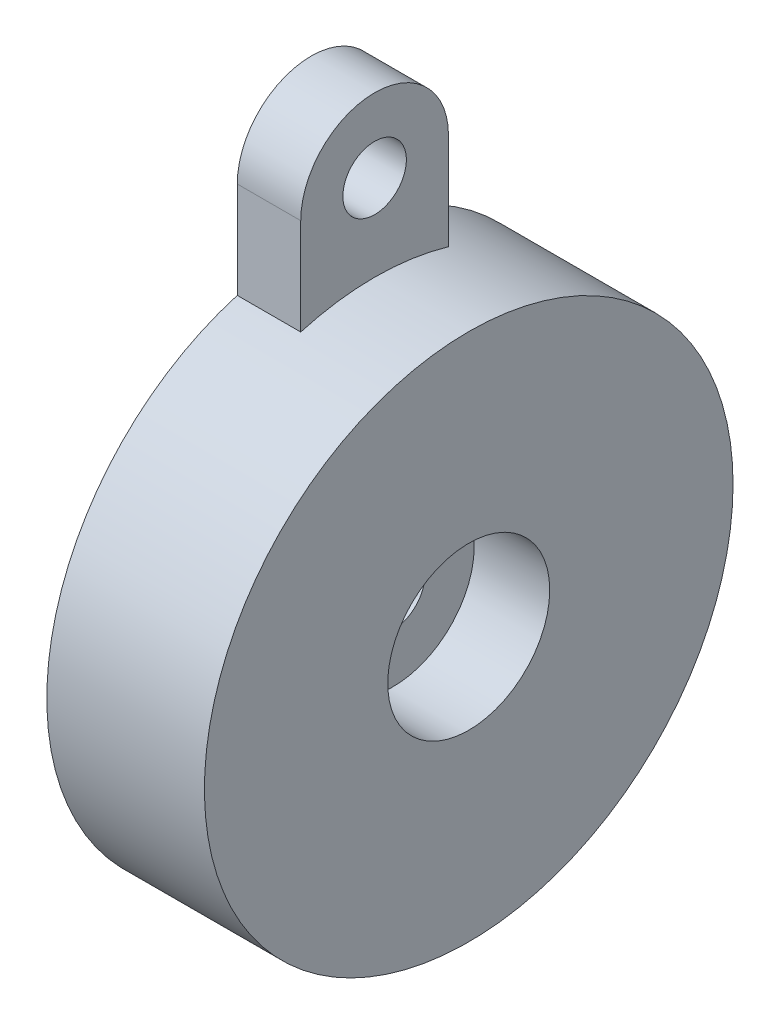
ISO-10303-21;
HEADER;
FILE_DESCRIPTION(('STEP AP214'),'2;1');
FILE_NAME('part.step','',(''),(''),'','','');
FILE_SCHEMA(('AUTOMOTIVE_DESIGN { 1 0 10303 214 1 1 1 1 }'));
ENDSEC;
DATA;
#1=APPLICATION_CONTEXT('core data for automotive mechanical design processes');
#2=APPLICATION_PROTOCOL_DEFINITION('international standard','automotive_design',2000,#1);
#3=PRODUCT_CONTEXT('',#1,'mechanical');
#4=PRODUCT('Part','Part','',(#3));
#5=PRODUCT_RELATED_PRODUCT_CATEGORY('part','',(#4));
#6=PRODUCT_DEFINITION_FORMATION('','',#4);
#7=PRODUCT_DEFINITION_CONTEXT('part definition',#1,'design');
#8=PRODUCT_DEFINITION('design','',#6,#7);
#9=PRODUCT_DEFINITION_SHAPE('','',#8);
#10=(LENGTH_UNIT() NAMED_UNIT(*) SI_UNIT(.MILLI.,.METRE.));
#11=(NAMED_UNIT(*) PLANE_ANGLE_UNIT() SI_UNIT($,.RADIAN.));
#12=(NAMED_UNIT(*) SI_UNIT($,.STERADIAN.) SOLID_ANGLE_UNIT());
#13=UNCERTAINTY_MEASURE_WITH_UNIT(LENGTH_MEASURE(1.E-05),#10,'distance_accuracy_value','');
#14=(GEOMETRIC_REPRESENTATION_CONTEXT(3) GLOBAL_UNCERTAINTY_ASSIGNED_CONTEXT((#13)) GLOBAL_UNIT_ASSIGNED_CONTEXT((#10,
#11,#12)) REPRESENTATION_CONTEXT('',''));
#15=CARTESIAN_POINT('',(0.,0.,0.));
#16=DIRECTION('',(0.,0.,1.));
#17=DIRECTION('',(1.,0.,0.));
#18=AXIS2_PLACEMENT_3D('',#15,#16,#17);
#19=CARTESIAN_POINT('',(3.6,0.,0.));
#20=DIRECTION('',(-1.,0.,0.));
#21=DIRECTION('',(0.,0.,1.));
#22=AXIS2_PLACEMENT_3D('',#19,#20,#21);
#23=CYLINDRICAL_SURFACE('',#22,1.45);
#24=CARTESIAN_POINT('',(-1.41,0.,0.));
#25=DIRECTION('',(-1.,0.,0.));
#26=DIRECTION('',(0.,0.,1.));
#27=AXIS2_PLACEMENT_3D('',#24,#25,#26);
#28=CIRCLE('',#27,1.45);
#29=CARTESIAN_POINT('',(-1.41,0.,1.45));
#30=VERTEX_POINT('',#29);
#31=EDGE_CURVE('E136',#30,#30,#28,.T.);
#32=ORIENTED_EDGE('',*,*,#31,.T.);
#33=EDGE_LOOP('',(#32));
#34=FACE_BOUND('',#33,.T.);
#35=CARTESIAN_POINT('',(0.15,0.,0.));
#36=DIRECTION('',(1.,0.,0.));
#37=DIRECTION('',(0.,0.,-1.));
#38=AXIS2_PLACEMENT_3D('',#35,#36,#37);
#39=CIRCLE('',#38,1.45);
#40=CARTESIAN_POINT('',(0.15,0.,-1.45));
#41=VERTEX_POINT('',#40);
#42=EDGE_CURVE('E133',#41,#41,#39,.F.);
#43=ORIENTED_EDGE('',*,*,#42,.F.);
#44=EDGE_LOOP('',(#43));
#45=FACE_BOUND('',#44,.T.);
#46=ADVANCED_FACE('F38',(#34,#45),#23,.F.);
#47=CARTESIAN_POINT('',(3.6,0.,0.));
#48=DIRECTION('',(-1.,0.,0.));
#49=DIRECTION('',(0.,0.,1.));
#50=AXIS2_PLACEMENT_3D('',#47,#48,#49);
#51=CYLINDRICAL_SURFACE('',#50,12.075);
#52=CARTESIAN_POINT('',(-3.6,0.,0.));
#53=DIRECTION('',(1.,0.,0.));
#54=DIRECTION('',(0.,0.,-1.));
#55=AXIS2_PLACEMENT_3D('',#52,#53,#54);
#56=CIRCLE('',#55,12.075);
#57=CARTESIAN_POINT('',(-3.6,11.5937483153638,3.375));
#58=VERTEX_POINT('',#57);
#59=CARTESIAN_POINT('',(-3.6,11.5937483153638,-3.375));
#60=VERTEX_POINT('',#59);
#61=EDGE_CURVE('E125',#58,#60,#56,.T.);
#62=ORIENTED_EDGE('',*,*,#61,.T.);
#63=DIRECTION('',(-1.,0.,0.));
#64=VECTOR('',#63,1.);
#65=CARTESIAN_POINT('',(3.6,11.5937483153638,-3.375));
#66=LINE('',#65,#64);
#67=CARTESIAN_POINT('',(-0.7,11.5937483153638,-3.375));
#68=VERTEX_POINT('',#67);
#69=EDGE_CURVE('E56',#60,#68,#66,.F.);
#70=ORIENTED_EDGE('',*,*,#69,.T.);
#71=CARTESIAN_POINT('',(-0.7,0.,0.));
#72=DIRECTION('',(-1.,0.,0.));
#73=DIRECTION('',(0.,0.,1.));
#74=AXIS2_PLACEMENT_3D('',#71,#72,#73);
#75=CIRCLE('',#74,12.075);
#76=CARTESIAN_POINT('',(-0.7,11.5937483153638,3.375));
#77=VERTEX_POINT('',#76);
#78=EDGE_CURVE('E48',#77,#68,#75,.T.);
#79=ORIENTED_EDGE('',*,*,#78,.F.);
#80=DIRECTION('',(-1.,0.,0.));
#81=VECTOR('',#80,1.);
#82=CARTESIAN_POINT('',(3.6,11.5937483153638,3.375));
#83=LINE('',#82,#81);
#84=EDGE_CURVE('E86',#77,#58,#83,.T.);
#85=ORIENTED_EDGE('',*,*,#84,.T.);
#86=EDGE_LOOP('',(#62,#70,#79,#85));
#87=FACE_BOUND('',#86,.T.);
#88=CARTESIAN_POINT('',(3.6,0.,0.));
#89=DIRECTION('',(1.,0.,0.));
#90=DIRECTION('',(0.,0.,-1.));
#91=AXIS2_PLACEMENT_3D('',#88,#89,#90);
#92=CIRCLE('',#91,12.075);
#93=CARTESIAN_POINT('',(3.6,0.,-12.075));
#94=VERTEX_POINT('',#93);
#95=EDGE_CURVE('E126',#94,#94,#92,.T.);
#96=ORIENTED_EDGE('',*,*,#95,.F.);
#97=EDGE_LOOP('',(#96));
#98=FACE_BOUND('',#97,.T.);
#99=ADVANCED_FACE('F40',(#87,#98),#51,.T.);
#100=CARTESIAN_POINT('',(3.6,0.,0.));
#101=DIRECTION('',(1.,0.,0.));
#102=DIRECTION('',(0.,0.,-1.));
#103=AXIS2_PLACEMENT_3D('',#100,#101,#102);
#104=PLANE('',#103);
#105=CARTESIAN_POINT('',(3.6,0.,0.));
#106=DIRECTION('',(1.,0.,0.));
#107=DIRECTION('',(0.,0.,-1.));
#108=AXIS2_PLACEMENT_3D('',#105,#106,#107);
#109=CIRCLE('',#108,3.7);
#110=CARTESIAN_POINT('',(3.6,0.,-3.7));
#111=VERTEX_POINT('',#110);
#112=EDGE_CURVE('E146',#111,#111,#109,.T.);
#113=ORIENTED_EDGE('',*,*,#112,.F.);
#114=EDGE_LOOP('',(#113));
#115=FACE_BOUND('',#114,.T.);
#116=ORIENTED_EDGE('',*,*,#95,.T.);
#117=EDGE_LOOP('',(#116));
#118=FACE_BOUND('',#117,.T.);
#119=ADVANCED_FACE('F179',(#115,#118),#104,.T.);
#120=CARTESIAN_POINT('',(-3.6,0.,0.));
#121=DIRECTION('',(1.,0.,0.));
#122=DIRECTION('',(0.,0.,-1.));
#123=AXIS2_PLACEMENT_3D('',#120,#121,#122);
#124=PLANE('',#123);
#125=CARTESIAN_POINT('',(-3.6,16.,0.));
#126=DIRECTION('',(-1.,0.,0.));
#127=DIRECTION('',(0.,0.,1.));
#128=AXIS2_PLACEMENT_3D('',#125,#126,#127);
#129=CIRCLE('',#128,1.45);
#130=CARTESIAN_POINT('',(-3.6,16.,1.45));
#131=VERTEX_POINT('',#130);
#132=EDGE_CURVE('E154',#131,#131,#129,.T.);
#133=ORIENTED_EDGE('',*,*,#132,.F.);
#134=EDGE_LOOP('',(#133));
#135=FACE_BOUND('',#134,.T.);
#136=CARTESIAN_POINT('',(-3.6,0.,0.));
#137=DIRECTION('',(-1.,0.,0.));
#138=DIRECTION('',(0.,0.,1.));
#139=AXIS2_PLACEMENT_3D('',#136,#137,#138);
#140=CIRCLE('',#139,6.125);
#141=CARTESIAN_POINT('',(-3.6,0.,6.125));
#142=VERTEX_POINT('',#141);
#143=EDGE_CURVE('E11',#142,#142,#140,.T.);
#144=ORIENTED_EDGE('',*,*,#143,.F.);
#145=EDGE_LOOP('',(#144));
#146=FACE_BOUND('',#145,.T.);
#147=ORIENTED_EDGE('',*,*,#61,.F.);
#148=DIRECTION('',(0.,1.,0.));
#149=VECTOR('',#148,1.);
#150=CARTESIAN_POINT('',(-3.6,0.,3.375));
#151=LINE('',#150,#149);
#152=CARTESIAN_POINT('',(-3.6,16.,3.375));
#153=VERTEX_POINT('',#152);
#154=EDGE_CURVE('E110',#58,#153,#151,.T.);
#155=ORIENTED_EDGE('',*,*,#154,.T.);
#156=CARTESIAN_POINT('',(-3.6,16.,0.));
#157=DIRECTION('',(-1.,0.,0.));
#158=DIRECTION('',(0.,0.,1.));
#159=AXIS2_PLACEMENT_3D('',#156,#157,#158);
#160=CIRCLE('',#159,3.375);
#161=CARTESIAN_POINT('',(-3.6,16.,-3.375));
#162=VERTEX_POINT('',#161);
#163=EDGE_CURVE('E98',#153,#162,#160,.T.);
#164=ORIENTED_EDGE('',*,*,#163,.T.);
#165=DIRECTION('',(0.,-1.,0.));
#166=VECTOR('',#165,1.);
#167=CARTESIAN_POINT('',(-3.6,0.,-3.375));
#168=LINE('',#167,#166);
#169=EDGE_CURVE('E91',#162,#60,#168,.T.);
#170=ORIENTED_EDGE('',*,*,#169,.T.);
#171=EDGE_LOOP('',(#147,#155,#164,#170));
#172=FACE_BOUND('',#171,.T.);
#173=ADVANCED_FACE('F175',(#135,#146,#172),#124,.F.);
#174=CARTESIAN_POINT('',(-0.7,0.,-3.375));
#175=DIRECTION('',(0.,0.,-1.));
#176=DIRECTION('',(-1.,0.,0.));
#177=AXIS2_PLACEMENT_3D('',#174,#175,#176);
#178=PLANE('',#177);
#179=ORIENTED_EDGE('',*,*,#69,.F.);
#180=ORIENTED_EDGE('',*,*,#169,.F.);
#181=DIRECTION('',(-1.,0.,0.));
#182=VECTOR('',#181,1.);
#183=CARTESIAN_POINT('',(-0.7,16.,-3.375));
#184=LINE('',#183,#182);
#185=CARTESIAN_POINT('',(-0.7,16.,-3.375));
#186=VERTEX_POINT('',#185);
#187=EDGE_CURVE('E100',#186,#162,#184,.T.);
#188=ORIENTED_EDGE('',*,*,#187,.F.);
#189=DIRECTION('',(0.,-1.,0.));
#190=VECTOR('',#189,1.);
#191=CARTESIAN_POINT('',(-0.7,0.,-3.375));
#192=LINE('',#191,#190);
#193=EDGE_CURVE('E101',#186,#68,#192,.T.);
#194=ORIENTED_EDGE('',*,*,#193,.T.);
#195=EDGE_LOOP('',(#179,#180,#188,#194));
#196=FACE_BOUND('',#195,.T.);
#197=ADVANCED_FACE('F178',(#196),#178,.T.);
#198=CARTESIAN_POINT('',(-0.7,0.,3.375));
#199=DIRECTION('',(0.,0.,1.));
#200=DIRECTION('',(1.,0.,0.));
#201=AXIS2_PLACEMENT_3D('',#198,#199,#200);
#202=PLANE('',#201);
#203=ORIENTED_EDGE('',*,*,#84,.F.);
#204=DIRECTION('',(0.,1.,0.));
#205=VECTOR('',#204,1.);
#206=CARTESIAN_POINT('',(-0.7,0.,3.375));
#207=LINE('',#206,#205);
#208=CARTESIAN_POINT('',(-0.7,16.,3.375));
#209=VERTEX_POINT('',#208);
#210=EDGE_CURVE('E80',#77,#209,#207,.T.);
#211=ORIENTED_EDGE('',*,*,#210,.T.);
#212=DIRECTION('',(-1.,0.,0.));
#213=VECTOR('',#212,1.);
#214=CARTESIAN_POINT('',(-0.7,16.,3.375));
#215=LINE('',#214,#213);
#216=EDGE_CURVE('E84',#209,#153,#215,.T.);
#217=ORIENTED_EDGE('',*,*,#216,.T.);
#218=ORIENTED_EDGE('',*,*,#154,.F.);
#219=EDGE_LOOP('',(#203,#211,#217,#218));
#220=FACE_BOUND('',#219,.T.);
#221=ADVANCED_FACE('F82',(#220),#202,.T.);
#222=CARTESIAN_POINT('',(-0.7,16.,0.));
#223=DIRECTION('',(-1.,0.,0.));
#224=DIRECTION('',(0.,0.,1.));
#225=AXIS2_PLACEMENT_3D('',#222,#223,#224);
#226=CYLINDRICAL_SURFACE('',#225,3.375);
#227=ORIENTED_EDGE('',*,*,#163,.F.);
#228=ORIENTED_EDGE('',*,*,#216,.F.);
#229=CARTESIAN_POINT('',(-0.7,16.,0.));
#230=DIRECTION('',(-1.,0.,0.));
#231=DIRECTION('',(0.,0.,1.));
#232=AXIS2_PLACEMENT_3D('',#229,#230,#231);
#233=CIRCLE('',#232,3.375);
#234=EDGE_CURVE('E90',#209,#186,#233,.T.);
#235=ORIENTED_EDGE('',*,*,#234,.T.);
#236=ORIENTED_EDGE('',*,*,#187,.T.);
#237=EDGE_LOOP('',(#227,#228,#235,#236));
#238=FACE_BOUND('',#237,.T.);
#239=ADVANCED_FACE('F95',(#238),#226,.T.);
#240=CARTESIAN_POINT('',(-0.7,0.,0.));
#241=DIRECTION('',(-1.,0.,0.));
#242=DIRECTION('',(0.,0.,1.));
#243=AXIS2_PLACEMENT_3D('',#240,#241,#242);
#244=PLANE('',#243);
#245=CARTESIAN_POINT('',(-0.7,16.,0.));
#246=DIRECTION('',(-1.,0.,0.));
#247=DIRECTION('',(0.,0.,1.));
#248=AXIS2_PLACEMENT_3D('',#245,#246,#247);
#249=CIRCLE('',#248,1.45);
#250=CARTESIAN_POINT('',(-0.7,16.,1.45));
#251=VERTEX_POINT('',#250);
#252=EDGE_CURVE('E42',#251,#251,#249,.T.);
#253=ORIENTED_EDGE('',*,*,#252,.T.);
#254=EDGE_LOOP('',(#253));
#255=FACE_BOUND('',#254,.T.);
#256=ORIENTED_EDGE('',*,*,#210,.F.);
#257=ORIENTED_EDGE('',*,*,#78,.T.);
#258=ORIENTED_EDGE('',*,*,#193,.F.);
#259=ORIENTED_EDGE('',*,*,#234,.F.);
#260=EDGE_LOOP('',(#256,#257,#258,#259));
#261=FACE_BOUND('',#260,.T.);
#262=ADVANCED_FACE('F103',(#255,#261),#244,.F.);
#263=CARTESIAN_POINT('',(-5.85,0.,0.));
#264=DIRECTION('',(1.,0.,0.));
#265=DIRECTION('',(0.,0.,-1.));
#266=AXIS2_PLACEMENT_3D('',#263,#264,#265);
#267=CYLINDRICAL_SURFACE('',#266,6.125);
#268=CARTESIAN_POINT('',(-5.85,0.,0.));
#269=DIRECTION('',(-1.,0.,0.));
#270=DIRECTION('',(0.,0.,1.));
#271=AXIS2_PLACEMENT_3D('',#268,#269,#270);
#272=CIRCLE('',#271,6.125);
#273=CARTESIAN_POINT('',(-5.85,0.,6.125));
#274=VERTEX_POINT('',#273);
#275=EDGE_CURVE('E113',#274,#274,#272,.T.);
#276=ORIENTED_EDGE('',*,*,#275,.F.);
#277=EDGE_LOOP('',(#276));
#278=FACE_BOUND('',#277,.T.);
#279=ORIENTED_EDGE('',*,*,#143,.T.);
#280=EDGE_LOOP('',(#279));
#281=FACE_BOUND('',#280,.T.);
#282=ADVANCED_FACE('F169',(#278,#281),#267,.T.);
#283=CARTESIAN_POINT('',(-5.85,0.,0.));
#284=DIRECTION('',(-1.,0.,0.));
#285=DIRECTION('',(0.,0.,1.));
#286=AXIS2_PLACEMENT_3D('',#283,#284,#285);
#287=PLANE('',#286);
#288=CARTESIAN_POINT('',(-5.85,0.,0.));
#289=DIRECTION('',(-1.,0.,0.));
#290=DIRECTION('',(0.,0.,1.));
#291=AXIS2_PLACEMENT_3D('',#288,#289,#290);
#292=CIRCLE('',#291,3.0625);
#293=CARTESIAN_POINT('',(-5.85,0.,3.0625));
#294=VERTEX_POINT('',#293);
#295=EDGE_CURVE('E143',#294,#294,#292,.T.);
#296=ORIENTED_EDGE('',*,*,#295,.F.);
#297=EDGE_LOOP('',(#296));
#298=FACE_BOUND('',#297,.T.);
#299=ORIENTED_EDGE('',*,*,#275,.T.);
#300=EDGE_LOOP('',(#299));
#301=FACE_BOUND('',#300,.T.);
#302=ADVANCED_FACE('F167',(#298,#301),#287,.T.);
#303=CARTESIAN_POINT('',(-1.41,0.,0.));
#304=DIRECTION('',(-1.,0.,0.));
#305=DIRECTION('',(0.,0.,1.));
#306=AXIS2_PLACEMENT_3D('',#303,#304,#305);
#307=CYLINDRICAL_SURFACE('',#306,3.0625);
#308=CARTESIAN_POINT('',(-1.41,0.,0.));
#309=DIRECTION('',(-1.,0.,0.));
#310=DIRECTION('',(0.,0.,1.));
#311=AXIS2_PLACEMENT_3D('',#308,#309,#310);
#312=CIRCLE('',#311,3.0625);
#313=CARTESIAN_POINT('',(-1.41,0.,3.0625));
#314=VERTEX_POINT('',#313);
#315=EDGE_CURVE('E156',#314,#314,#312,.T.);
#316=ORIENTED_EDGE('',*,*,#315,.F.);
#317=EDGE_LOOP('',(#316));
#318=FACE_BOUND('',#317,.T.);
#319=ORIENTED_EDGE('',*,*,#295,.T.);
#320=EDGE_LOOP('',(#319));
#321=FACE_BOUND('',#320,.T.);
#322=ADVANCED_FACE('F208',(#318,#321),#307,.F.);
#323=CARTESIAN_POINT('',(-1.41,0.,0.));
#324=DIRECTION('',(-1.,0.,0.));
#325=DIRECTION('',(0.,0.,1.));
#326=AXIS2_PLACEMENT_3D('',#323,#324,#325);
#327=PLANE('',#326);
#328=ORIENTED_EDGE('',*,*,#31,.F.);
#329=EDGE_LOOP('',(#328));
#330=FACE_BOUND('',#329,.T.);
#331=ORIENTED_EDGE('',*,*,#315,.T.);
#332=EDGE_LOOP('',(#331));
#333=FACE_BOUND('',#332,.T.);
#334=ADVANCED_FACE('F204',(#330,#333),#327,.T.);
#335=CARTESIAN_POINT('',(0.15,0.,0.));
#336=DIRECTION('',(1.,0.,0.));
#337=DIRECTION('',(0.,0.,-1.));
#338=AXIS2_PLACEMENT_3D('',#335,#336,#337);
#339=PLANE('',#338);
#340=CARTESIAN_POINT('',(0.15,0.,0.));
#341=DIRECTION('',(1.,0.,0.));
#342=DIRECTION('',(0.,0.,-1.));
#343=AXIS2_PLACEMENT_3D('',#340,#341,#342);
#344=CIRCLE('',#343,3.7);
#345=CARTESIAN_POINT('',(0.15,0.,-3.7));
#346=VERTEX_POINT('',#345);
#347=EDGE_CURVE('E137',#346,#346,#344,.T.);
#348=ORIENTED_EDGE('',*,*,#347,.T.);
#349=EDGE_LOOP('',(#348));
#350=FACE_BOUND('',#349,.T.);
#351=ORIENTED_EDGE('',*,*,#42,.T.);
#352=EDGE_LOOP('',(#351));
#353=FACE_BOUND('',#352,.T.);
#354=ADVANCED_FACE('F207',(#350,#353),#339,.T.);
#355=CARTESIAN_POINT('',(0.15,0.,0.));
#356=DIRECTION('',(1.,0.,0.));
#357=DIRECTION('',(0.,0.,-1.));
#358=AXIS2_PLACEMENT_3D('',#355,#356,#357);
#359=CYLINDRICAL_SURFACE('',#358,3.7);
#360=CARTESIAN_POINT('',(0.15,0.,-3.7));
#361=CARTESIAN_POINT('',(0.1859375,0.,-3.7));
#362=CARTESIAN_POINT('',(0.221875,0.,-3.7));
#363=CARTESIAN_POINT('',(0.29375,0.,-3.7));
#364=CARTESIAN_POINT('',(0.3296875,0.,-3.7));
#365=CARTESIAN_POINT('',(0.4015625,0.,-3.7));
#366=CARTESIAN_POINT('',(0.4375,0.,-3.7));
#367=CARTESIAN_POINT('',(0.509374999999999,0.,-3.7));
#368=CARTESIAN_POINT('',(0.5453125,0.,-3.7));
#369=CARTESIAN_POINT('',(0.6171875,0.,-3.7));
#370=CARTESIAN_POINT('',(0.653125,0.,-3.7));
#371=CARTESIAN_POINT('',(0.725,0.,-3.7));
#372=CARTESIAN_POINT('',(0.7609375,0.,-3.7));
#373=CARTESIAN_POINT('',(0.8328125,0.,-3.7));
#374=CARTESIAN_POINT('',(0.868749999999999,0.,-3.7));
#375=CARTESIAN_POINT('',(0.940624999999999,0.,-3.7));
#376=CARTESIAN_POINT('',(0.9765625,0.,-3.7));
#377=CARTESIAN_POINT('',(1.0484375,0.,-3.7));
#378=CARTESIAN_POINT('',(1.084375,0.,-3.7));
#379=CARTESIAN_POINT('',(1.15625,0.,-3.7));
#380=CARTESIAN_POINT('',(1.1921875,0.,-3.7));
#381=CARTESIAN_POINT('',(1.2640625,0.,-3.7));
#382=CARTESIAN_POINT('',(1.3,0.,-3.7));
#383=CARTESIAN_POINT('',(1.371875,0.,-3.7));
#384=CARTESIAN_POINT('',(1.4078125,0.,-3.7));
#385=CARTESIAN_POINT('',(1.4796875,0.,-3.7));
#386=CARTESIAN_POINT('',(1.515625,0.,-3.7));
#387=CARTESIAN_POINT('',(1.5875,0.,-3.7));
#388=CARTESIAN_POINT('',(1.6234375,0.,-3.7));
#389=CARTESIAN_POINT('',(1.6953125,0.,-3.7));
#390=CARTESIAN_POINT('',(1.73125,0.,-3.7));
#391=CARTESIAN_POINT('',(1.803125,0.,-3.7));
#392=CARTESIAN_POINT('',(1.8390625,0.,-3.7));
#393=CARTESIAN_POINT('',(1.9109375,0.,-3.7));
#394=CARTESIAN_POINT('',(1.946875,0.,-3.7));
#395=CARTESIAN_POINT('',(2.01875,0.,-3.7));
#396=CARTESIAN_POINT('',(2.0546875,0.,-3.7));
#397=CARTESIAN_POINT('',(2.1265625,0.,-3.7));
#398=CARTESIAN_POINT('',(2.1625,0.,-3.7));
#399=CARTESIAN_POINT('',(2.234375,0.,-3.7));
#400=CARTESIAN_POINT('',(2.2703125,0.,-3.7));
#401=CARTESIAN_POINT('',(2.3421875,0.,-3.7));
#402=CARTESIAN_POINT('',(2.378125,0.,-3.7));
#403=CARTESIAN_POINT('',(2.45,0.,-3.7));
#404=CARTESIAN_POINT('',(2.4859375,0.,-3.7));
#405=CARTESIAN_POINT('',(2.5578125,0.,-3.7));
#406=CARTESIAN_POINT('',(2.59375,0.,-3.7));
#407=CARTESIAN_POINT('',(2.665625,0.,-3.7));
#408=CARTESIAN_POINT('',(2.7015625,0.,-3.7));
#409=CARTESIAN_POINT('',(2.7734375,0.,-3.7));
#410=CARTESIAN_POINT('',(2.809375,0.,-3.7));
#411=CARTESIAN_POINT('',(2.88125,0.,-3.7));
#412=CARTESIAN_POINT('',(2.9171875,0.,-3.7));
#413=CARTESIAN_POINT('',(2.9890625,0.,-3.7));
#414=CARTESIAN_POINT('',(3.025,0.,-3.7));
#415=CARTESIAN_POINT('',(3.096875,0.,-3.7));
#416=CARTESIAN_POINT('',(3.1328125,0.,-3.7));
#417=CARTESIAN_POINT('',(3.2046875,0.,-3.7));
#418=CARTESIAN_POINT('',(3.240625,0.,-3.7));
#419=CARTESIAN_POINT('',(3.3125,0.,-3.7));
#420=CARTESIAN_POINT('',(3.3484375,0.,-3.7));
#421=CARTESIAN_POINT('',(3.4203125,0.,-3.7));
#422=CARTESIAN_POINT('',(3.45625,0.,-3.7));
#423=CARTESIAN_POINT('',(3.528125,0.,-3.7));
#424=CARTESIAN_POINT('',(3.5640625,0.,-3.7));
#425=CARTESIAN_POINT('',(3.6,0.,-3.7));
#426=B_SPLINE_CURVE_WITH_KNOTS('',3,(#360,#361,#362,#363,#364,#365,#366,#367,#368,#369,#370,
#371,#372,#373,#374,#375,#376,#377,#378,#379,#380,#381,#382,#383,#384,#385,#386,#387,#388,#389,
#390,#391,#392,#393,#394,#395,#396,#397,#398,#399,#400,#401,#402,#403,#404,#405,#406,#407,#408,
#409,#410,#411,#412,#413,#414,#415,#416,#417,#418,#419,#420,#421,#422,#423,#424,#425),
.UNSPECIFIED.,.F.,.F.,(4,2,2,2,2,2,2,2,2,2,2,2,2,2,2,2,2,2,2,2,2,2,2,2,2,2,2,2,2,2,2,2,4),(0.,
0.1078125,0.215625,0.3234375,0.43125,0.5390625,0.646875,0.7546875,0.8625,0.9703125,1.078125,
1.1859375,1.29375,1.4015625,1.509375,1.6171875,1.725,1.8328125,1.940625,2.0484375,2.15625,
2.2640625,2.371875,2.4796875,2.5875,2.6953125,2.803125,2.9109375,3.01875,3.1265625,3.234375,
3.3421875,3.45),.UNSPECIFIED.);
#427=EDGE_CURVE('BSEAM202',#346,#111,#426,.T.);
#428=ORIENTED_EDGE('',*,*,#347,.F.);
#429=ORIENTED_EDGE('',*,*,#112,.T.);
#430=ORIENTED_EDGE('',*,*,#427,.T.);
#431=ORIENTED_EDGE('',*,*,#427,.F.);
#432=EDGE_LOOP('',(#428,#430,#429,#431));
#433=FACE_BOUND('',#432,.T.);
#434=ADVANCED_FACE('F202',(#433),#359,.F.);
#435=CARTESIAN_POINT('',(3.6,16.,0.));
#436=DIRECTION('',(-1.,0.,0.));
#437=DIRECTION('',(0.,0.,1.));
#438=AXIS2_PLACEMENT_3D('',#435,#436,#437);
#439=CYLINDRICAL_SURFACE('',#438,1.45);
#440=ORIENTED_EDGE('',*,*,#132,.T.);
#441=EDGE_LOOP('',(#440));
#442=FACE_BOUND('',#441,.T.);
#443=ORIENTED_EDGE('',*,*,#252,.F.);
#444=EDGE_LOOP('',(#443));
#445=FACE_BOUND('',#444,.T.);
#446=ADVANCED_FACE('F266',(#442,#445),#439,.F.);
#447=CLOSED_SHELL('',(#46,#99,#119,#173,#197,#221,#239,#262,#282,#302,#322,#334,#354,#434,#446));
#448=MANIFOLD_SOLID_BREP('B2',#447);
#449=ADVANCED_BREP_SHAPE_REPRESENTATION('',(#18,#448),#14);
#450=SHAPE_DEFINITION_REPRESENTATION(#9,#449);
ENDSEC;
END-ISO-10303-21;
